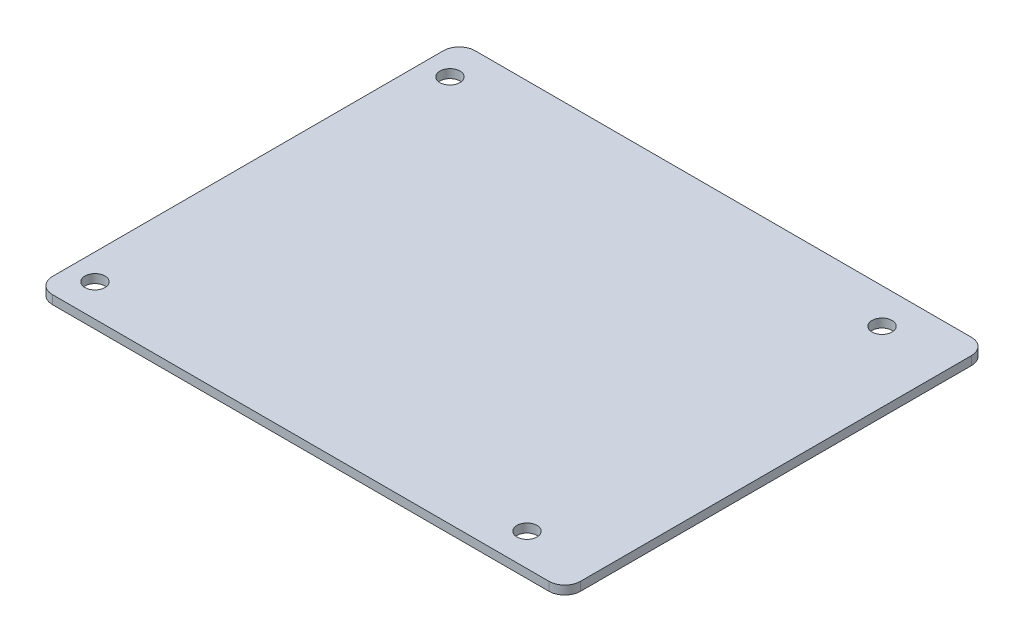
ISO-10303-21;
HEADER;
FILE_DESCRIPTION(('STEP AP214'),'2;1');
FILE_NAME('part.step','',(''),(''),'','','');
FILE_SCHEMA(('AUTOMOTIVE_DESIGN { 1 0 10303 214 1 1 1 1 }'));
ENDSEC;
DATA;
#1=APPLICATION_CONTEXT('core data for automotive mechanical design processes');
#2=APPLICATION_PROTOCOL_DEFINITION('international standard','automotive_design',2000,#1);
#3=PRODUCT_CONTEXT('',#1,'mechanical');
#4=PRODUCT('Part','Part','',(#3));
#5=PRODUCT_RELATED_PRODUCT_CATEGORY('part','',(#4));
#6=PRODUCT_DEFINITION_FORMATION('','',#4);
#7=PRODUCT_DEFINITION_CONTEXT('part definition',#1,'design');
#8=PRODUCT_DEFINITION('design','',#6,#7);
#9=PRODUCT_DEFINITION_SHAPE('','',#8);
#10=(LENGTH_UNIT() NAMED_UNIT(*) SI_UNIT(.MILLI.,.METRE.));
#11=(NAMED_UNIT(*) PLANE_ANGLE_UNIT() SI_UNIT($,.RADIAN.));
#12=(NAMED_UNIT(*) SI_UNIT($,.STERADIAN.) SOLID_ANGLE_UNIT());
#13=UNCERTAINTY_MEASURE_WITH_UNIT(LENGTH_MEASURE(1.E-05),#10,'distance_accuracy_value','');
#14=(GEOMETRIC_REPRESENTATION_CONTEXT(3) GLOBAL_UNCERTAINTY_ASSIGNED_CONTEXT((#13)) GLOBAL_UNIT_ASSIGNED_CONTEXT((#10,
#11,#12)) REPRESENTATION_CONTEXT('',''));
#15=CARTESIAN_POINT('',(0.,0.,0.));
#16=DIRECTION('',(0.,0.,1.));
#17=DIRECTION('',(1.,0.,0.));
#18=AXIS2_PLACEMENT_3D('',#15,#16,#17);
#19=CARTESIAN_POINT('',(-50.06,0.825,40.06));
#20=DIRECTION('',(1.,0.,0.));
#21=DIRECTION('',(0.,0.,-1.));
#22=AXIS2_PLACEMENT_3D('',#19,#20,#21);
#23=PLANE('',#22);
#24=DIRECTION('',(0.,0.,1.));
#25=VECTOR('',#24,1.);
#26=CARTESIAN_POINT('',(-50.06,0.825,40.06));
#27=LINE('',#26,#25);
#28=CARTESIAN_POINT('',(-50.06,0.825,-37.06));
#29=VERTEX_POINT('',#28);
#30=CARTESIAN_POINT('',(-50.06,0.825,37.06));
#31=VERTEX_POINT('',#30);
#32=EDGE_CURVE('E132',#29,#31,#27,.T.);
#33=ORIENTED_EDGE('',*,*,#32,.F.);
#34=DIRECTION('',(0.,-1.,0.));
#35=VECTOR('',#34,1.);
#36=CARTESIAN_POINT('',(-50.06,0.825,-37.06));
#37=LINE('',#36,#35);
#38=CARTESIAN_POINT('',(-50.06,-0.825,-37.06));
#39=VERTEX_POINT('',#38);
#40=EDGE_CURVE('E116',#29,#39,#37,.T.);
#41=ORIENTED_EDGE('',*,*,#40,.T.);
#42=DIRECTION('',(0.,0.,1.));
#43=VECTOR('',#42,1.);
#44=CARTESIAN_POINT('',(-50.06,-0.825,40.06));
#45=LINE('',#44,#43);
#46=CARTESIAN_POINT('',(-50.06,-0.825,37.06));
#47=VERTEX_POINT('',#46);
#48=EDGE_CURVE('E129',#39,#47,#45,.T.);
#49=ORIENTED_EDGE('',*,*,#48,.T.);
#50=DIRECTION('',(0.,-1.,0.));
#51=VECTOR('',#50,1.);
#52=CARTESIAN_POINT('',(-50.06,0.825,37.06));
#53=LINE('',#52,#51);
#54=EDGE_CURVE('E135',#47,#31,#53,.F.);
#55=ORIENTED_EDGE('',*,*,#54,.T.);
#56=EDGE_LOOP('',(#33,#41,#49,#55));
#57=FACE_BOUND('',#56,.T.);
#58=ADVANCED_FACE('F45',(#57),#23,.F.);
#59=CARTESIAN_POINT('',(50.06,0.825,40.06));
#60=DIRECTION('',(0.,0.,-1.));
#61=DIRECTION('',(-1.,0.,0.));
#62=AXIS2_PLACEMENT_3D('',#59,#60,#61);
#63=PLANE('',#62);
#64=DIRECTION('',(1.,0.,0.));
#65=VECTOR('',#64,1.);
#66=CARTESIAN_POINT('',(50.06,-0.825,40.06));
#67=LINE('',#66,#65);
#68=CARTESIAN_POINT('',(-47.06,-0.825,40.06));
#69=VERTEX_POINT('',#68);
#70=CARTESIAN_POINT('',(47.06,-0.825,40.06));
#71=VERTEX_POINT('',#70);
#72=EDGE_CURVE('E140',#69,#71,#67,.T.);
#73=ORIENTED_EDGE('',*,*,#72,.T.);
#74=DIRECTION('',(0.,-1.,0.));
#75=VECTOR('',#74,1.);
#76=CARTESIAN_POINT('',(47.06,0.825,40.06));
#77=LINE('',#76,#75);
#78=CARTESIAN_POINT('',(47.06,0.825,40.06));
#79=VERTEX_POINT('',#78);
#80=EDGE_CURVE('E11',#71,#79,#77,.F.);
#81=ORIENTED_EDGE('',*,*,#80,.T.);
#82=DIRECTION('',(1.,0.,0.));
#83=VECTOR('',#82,1.);
#84=CARTESIAN_POINT('',(50.06,0.825,40.06));
#85=LINE('',#84,#83);
#86=CARTESIAN_POINT('',(-47.06,0.825,40.06));
#87=VERTEX_POINT('',#86);
#88=EDGE_CURVE('E197',#87,#79,#85,.T.);
#89=ORIENTED_EDGE('',*,*,#88,.F.);
#90=DIRECTION('',(0.,-1.,0.));
#91=VECTOR('',#90,1.);
#92=CARTESIAN_POINT('',(-47.06,0.825,40.06));
#93=LINE('',#92,#91);
#94=EDGE_CURVE('E54',#87,#69,#93,.T.);
#95=ORIENTED_EDGE('',*,*,#94,.T.);
#96=EDGE_LOOP('',(#73,#81,#89,#95));
#97=FACE_BOUND('',#96,.T.);
#98=ADVANCED_FACE('F195',(#97),#63,.F.);
#99=CARTESIAN_POINT('',(50.06,0.825,40.06));
#100=DIRECTION('',(-1.,0.,0.));
#101=DIRECTION('',(0.,0.,1.));
#102=AXIS2_PLACEMENT_3D('',#99,#100,#101);
#103=PLANE('',#102);
#104=DIRECTION('',(0.,0.,-1.));
#105=VECTOR('',#104,1.);
#106=CARTESIAN_POINT('',(50.06,-0.825,40.06));
#107=LINE('',#106,#105);
#108=CARTESIAN_POINT('',(50.06,-0.825,37.06));
#109=VERTEX_POINT('',#108);
#110=CARTESIAN_POINT('',(50.06,-0.825,-37.06));
#111=VERTEX_POINT('',#110);
#112=EDGE_CURVE('E146',#109,#111,#107,.T.);
#113=ORIENTED_EDGE('',*,*,#112,.T.);
#114=DIRECTION('',(0.,-1.,0.));
#115=VECTOR('',#114,1.);
#116=CARTESIAN_POINT('',(50.06,0.825,-37.06));
#117=LINE('',#116,#115);
#118=CARTESIAN_POINT('',(50.06,0.825,-37.06));
#119=VERTEX_POINT('',#118);
#120=EDGE_CURVE('E61',#111,#119,#117,.F.);
#121=ORIENTED_EDGE('',*,*,#120,.T.);
#122=DIRECTION('',(0.,0.,-1.));
#123=VECTOR('',#122,1.);
#124=CARTESIAN_POINT('',(50.06,0.825,40.06));
#125=LINE('',#124,#123);
#126=CARTESIAN_POINT('',(50.06,0.825,37.06));
#127=VERTEX_POINT('',#126);
#128=EDGE_CURVE('E205',#127,#119,#125,.T.);
#129=ORIENTED_EDGE('',*,*,#128,.F.);
#130=DIRECTION('',(0.,-1.,0.));
#131=VECTOR('',#130,1.);
#132=CARTESIAN_POINT('',(50.06,0.825,37.06));
#133=LINE('',#132,#131);
#134=EDGE_CURVE('E185',#127,#109,#133,.T.);
#135=ORIENTED_EDGE('',*,*,#134,.T.);
#136=EDGE_LOOP('',(#113,#121,#129,#135));
#137=FACE_BOUND('',#136,.T.);
#138=ADVANCED_FACE('F204',(#137),#103,.F.);
#139=CARTESIAN_POINT('',(50.06,0.825,-40.06));
#140=DIRECTION('',(0.,0.,1.));
#141=DIRECTION('',(1.,0.,0.));
#142=AXIS2_PLACEMENT_3D('',#139,#140,#141);
#143=PLANE('',#142);
#144=DIRECTION('',(-1.,0.,0.));
#145=VECTOR('',#144,1.);
#146=CARTESIAN_POINT('',(50.06,-0.825,-40.06));
#147=LINE('',#146,#145);
#148=CARTESIAN_POINT('',(47.06,-0.825,-40.06));
#149=VERTEX_POINT('',#148);
#150=CARTESIAN_POINT('',(-47.06,-0.825,-40.06));
#151=VERTEX_POINT('',#150);
#152=EDGE_CURVE('E157',#149,#151,#147,.T.);
#153=ORIENTED_EDGE('',*,*,#152,.T.);
#154=DIRECTION('',(0.,-1.,0.));
#155=VECTOR('',#154,1.);
#156=CARTESIAN_POINT('',(-47.06,0.825,-40.06));
#157=LINE('',#156,#155);
#158=CARTESIAN_POINT('',(-47.06,0.825,-40.06));
#159=VERTEX_POINT('',#158);
#160=EDGE_CURVE('E117',#151,#159,#157,.F.);
#161=ORIENTED_EDGE('',*,*,#160,.T.);
#162=DIRECTION('',(-1.,0.,0.));
#163=VECTOR('',#162,1.);
#164=CARTESIAN_POINT('',(50.06,0.825,-40.06));
#165=LINE('',#164,#163);
#166=CARTESIAN_POINT('',(47.06,0.825,-40.06));
#167=VERTEX_POINT('',#166);
#168=EDGE_CURVE('E152',#167,#159,#165,.T.);
#169=ORIENTED_EDGE('',*,*,#168,.F.);
#170=DIRECTION('',(0.,-1.,0.));
#171=VECTOR('',#170,1.);
#172=CARTESIAN_POINT('',(47.06,0.825,-40.06));
#173=LINE('',#172,#171);
#174=EDGE_CURVE('E123',#167,#149,#173,.T.);
#175=ORIENTED_EDGE('',*,*,#174,.T.);
#176=EDGE_LOOP('',(#153,#161,#169,#175));
#177=FACE_BOUND('',#176,.T.);
#178=ADVANCED_FACE('F294',(#177),#143,.F.);
#179=CARTESIAN_POINT('',(0.,0.825,0.));
#180=DIRECTION('',(0.,1.,0.));
#181=DIRECTION('',(0.,0.,1.));
#182=AXIS2_PLACEMENT_3D('',#179,#180,#181);
#183=PLANE('',#182);
#184=CARTESIAN_POINT('',(36.76,0.825,-33.3925));
#185=DIRECTION('',(0.,1.,0.));
#186=DIRECTION('',(0.,0.,1.));
#187=AXIS2_PLACEMENT_3D('',#184,#185,#186);
#188=CIRCLE('',#187,1.905);
#189=CARTESIAN_POINT('',(36.76,0.825,-31.4875));
#190=VERTEX_POINT('',#189);
#191=EDGE_CURVE('E219',#190,#190,#188,.T.);
#192=ORIENTED_EDGE('',*,*,#191,.F.);
#193=EDGE_LOOP('',(#192));
#194=FACE_BOUND('',#193,.T.);
#195=CARTESIAN_POINT('',(36.76,0.825,33.9175));
#196=DIRECTION('',(0.,1.,0.));
#197=DIRECTION('',(0.,0.,1.));
#198=AXIS2_PLACEMENT_3D('',#195,#196,#197);
#199=CIRCLE('',#198,1.905);
#200=CARTESIAN_POINT('',(36.76,0.825,35.8225));
#201=VERTEX_POINT('',#200);
#202=EDGE_CURVE('E228',#201,#201,#199,.T.);
#203=ORIENTED_EDGE('',*,*,#202,.F.);
#204=EDGE_LOOP('',(#203));
#205=FACE_BOUND('',#204,.T.);
#206=CARTESIAN_POINT('',(-45.155,0.825,33.9175));
#207=DIRECTION('',(0.,1.,0.));
#208=DIRECTION('',(0.,0.,1.));
#209=AXIS2_PLACEMENT_3D('',#206,#207,#208);
#210=CIRCLE('',#209,1.905);
#211=CARTESIAN_POINT('',(-45.155,0.825,35.8225));
#212=VERTEX_POINT('',#211);
#213=EDGE_CURVE('E218',#212,#212,#210,.T.);
#214=ORIENTED_EDGE('',*,*,#213,.F.);
#215=EDGE_LOOP('',(#214));
#216=FACE_BOUND('',#215,.T.);
#217=CARTESIAN_POINT('',(-45.155,0.825,-33.3925));
#218=DIRECTION('',(0.,1.,0.));
#219=DIRECTION('',(0.,0.,1.));
#220=AXIS2_PLACEMENT_3D('',#217,#218,#219);
#221=CIRCLE('',#220,1.905);
#222=CARTESIAN_POINT('',(-45.155,0.825,-31.4875));
#223=VERTEX_POINT('',#222);
#224=EDGE_CURVE('E149',#223,#223,#221,.T.);
#225=ORIENTED_EDGE('',*,*,#224,.F.);
#226=EDGE_LOOP('',(#225));
#227=FACE_BOUND('',#226,.T.);
#228=ORIENTED_EDGE('',*,*,#168,.T.);
#229=CARTESIAN_POINT('',(-47.06,0.825,-37.06));
#230=DIRECTION('',(0.,1.,0.));
#231=DIRECTION('',(0.,0.,1.));
#232=AXIS2_PLACEMENT_3D('',#229,#230,#231);
#233=CIRCLE('',#232,3.);
#234=EDGE_CURVE('E182',#159,#29,#233,.T.);
#235=ORIENTED_EDGE('',*,*,#234,.T.);
#236=ORIENTED_EDGE('',*,*,#32,.T.);
#237=CARTESIAN_POINT('',(-47.06,0.825,37.06));
#238=DIRECTION('',(0.,1.,0.));
#239=DIRECTION('',(0.,0.,1.));
#240=AXIS2_PLACEMENT_3D('',#237,#238,#239);
#241=CIRCLE('',#240,3.);
#242=EDGE_CURVE('E174',#31,#87,#241,.T.);
#243=ORIENTED_EDGE('',*,*,#242,.T.);
#244=ORIENTED_EDGE('',*,*,#88,.T.);
#245=CARTESIAN_POINT('',(47.06,0.825,37.06));
#246=DIRECTION('',(0.,1.,0.));
#247=DIRECTION('',(0.,0.,1.));
#248=AXIS2_PLACEMENT_3D('',#245,#246,#247);
#249=CIRCLE('',#248,3.);
#250=EDGE_CURVE('E68',#79,#127,#249,.T.);
#251=ORIENTED_EDGE('',*,*,#250,.T.);
#252=ORIENTED_EDGE('',*,*,#128,.T.);
#253=CARTESIAN_POINT('',(47.06,0.825,-37.06));
#254=DIRECTION('',(0.,1.,0.));
#255=DIRECTION('',(0.,0.,1.));
#256=AXIS2_PLACEMENT_3D('',#253,#254,#255);
#257=CIRCLE('',#256,3.);
#258=EDGE_CURVE('E179',#119,#167,#257,.T.);
#259=ORIENTED_EDGE('',*,*,#258,.T.);
#260=EDGE_LOOP('',(#228,#235,#236,#243,#244,#251,#252,#259));
#261=FACE_BOUND('',#260,.T.);
#262=ADVANCED_FACE('F247',(#194,#205,#216,#227,#261),#183,.T.);
#263=CARTESIAN_POINT('',(0.,-0.825,0.));
#264=DIRECTION('',(0.,1.,0.));
#265=DIRECTION('',(0.,0.,1.));
#266=AXIS2_PLACEMENT_3D('',#263,#264,#265);
#267=PLANE('',#266);
#268=CARTESIAN_POINT('',(36.76,-0.825,-33.3925));
#269=DIRECTION('',(0.,1.,0.));
#270=DIRECTION('',(0.,0.,1.));
#271=AXIS2_PLACEMENT_3D('',#268,#269,#270);
#272=CIRCLE('',#271,1.905);
#273=CARTESIAN_POINT('',(36.76,-0.825,-31.4875));
#274=VERTEX_POINT('',#273);
#275=EDGE_CURVE('E224',#274,#274,#272,.F.);
#276=ORIENTED_EDGE('',*,*,#275,.F.);
#277=EDGE_LOOP('',(#276));
#278=FACE_BOUND('',#277,.T.);
#279=CARTESIAN_POINT('',(36.76,-0.825,33.9175));
#280=DIRECTION('',(0.,1.,0.));
#281=DIRECTION('',(0.,0.,1.));
#282=AXIS2_PLACEMENT_3D('',#279,#280,#281);
#283=CIRCLE('',#282,1.905);
#284=CARTESIAN_POINT('',(36.76,-0.825,35.8225));
#285=VERTEX_POINT('',#284);
#286=EDGE_CURVE('E223',#285,#285,#283,.F.);
#287=ORIENTED_EDGE('',*,*,#286,.F.);
#288=EDGE_LOOP('',(#287));
#289=FACE_BOUND('',#288,.T.);
#290=CARTESIAN_POINT('',(-45.155,-0.825,33.9175));
#291=DIRECTION('',(0.,1.,0.));
#292=DIRECTION('',(0.,0.,1.));
#293=AXIS2_PLACEMENT_3D('',#290,#291,#292);
#294=CIRCLE('',#293,1.905);
#295=CARTESIAN_POINT('',(-45.155,-0.825,35.8225));
#296=VERTEX_POINT('',#295);
#297=EDGE_CURVE('E232',#296,#296,#294,.F.);
#298=ORIENTED_EDGE('',*,*,#297,.F.);
#299=EDGE_LOOP('',(#298));
#300=FACE_BOUND('',#299,.T.);
#301=CARTESIAN_POINT('',(-45.155,-0.825,-33.3925));
#302=DIRECTION('',(0.,1.,0.));
#303=DIRECTION('',(0.,0.,1.));
#304=AXIS2_PLACEMENT_3D('',#301,#302,#303);
#305=CIRCLE('',#304,1.905);
#306=CARTESIAN_POINT('',(-45.155,-0.825,-31.4875));
#307=VERTEX_POINT('',#306);
#308=EDGE_CURVE('E141',#307,#307,#305,.F.);
#309=ORIENTED_EDGE('',*,*,#308,.F.);
#310=EDGE_LOOP('',(#309));
#311=FACE_BOUND('',#310,.T.);
#312=ORIENTED_EDGE('',*,*,#48,.F.);
#313=CARTESIAN_POINT('',(-47.06,-0.825,-37.06));
#314=DIRECTION('',(0.,1.,0.));
#315=DIRECTION('',(0.,0.,1.));
#316=AXIS2_PLACEMENT_3D('',#313,#314,#315);
#317=CIRCLE('',#316,3.);
#318=EDGE_CURVE('E112',#39,#151,#317,.F.);
#319=ORIENTED_EDGE('',*,*,#318,.T.);
#320=ORIENTED_EDGE('',*,*,#152,.F.);
#321=CARTESIAN_POINT('',(47.06,-0.825,-37.06));
#322=DIRECTION('',(0.,1.,0.));
#323=DIRECTION('',(0.,0.,1.));
#324=AXIS2_PLACEMENT_3D('',#321,#322,#323);
#325=CIRCLE('',#324,3.);
#326=EDGE_CURVE('E124',#149,#111,#325,.F.);
#327=ORIENTED_EDGE('',*,*,#326,.T.);
#328=ORIENTED_EDGE('',*,*,#112,.F.);
#329=CARTESIAN_POINT('',(47.06,-0.825,37.06));
#330=DIRECTION('',(0.,1.,0.));
#331=DIRECTION('',(0.,0.,1.));
#332=AXIS2_PLACEMENT_3D('',#329,#330,#331);
#333=CIRCLE('',#332,3.);
#334=EDGE_CURVE('E164',#109,#71,#333,.F.);
#335=ORIENTED_EDGE('',*,*,#334,.T.);
#336=ORIENTED_EDGE('',*,*,#72,.F.);
#337=CARTESIAN_POINT('',(-47.06,-0.825,37.06));
#338=DIRECTION('',(0.,1.,0.));
#339=DIRECTION('',(0.,0.,1.));
#340=AXIS2_PLACEMENT_3D('',#337,#338,#339);
#341=CIRCLE('',#340,3.);
#342=EDGE_CURVE('E134',#69,#47,#341,.F.);
#343=ORIENTED_EDGE('',*,*,#342,.T.);
#344=EDGE_LOOP('',(#312,#319,#320,#327,#328,#335,#336,#343));
#345=FACE_BOUND('',#344,.T.);
#346=ADVANCED_FACE('F137',(#278,#289,#300,#311,#345),#267,.F.);
#347=CARTESIAN_POINT('',(-47.06,0.825,-37.06));
#348=DIRECTION('',(0.,-1.,0.));
#349=DIRECTION('',(0.,0.,-1.));
#350=AXIS2_PLACEMENT_3D('',#347,#348,#349);
#351=CYLINDRICAL_SURFACE('',#350,3.);
#352=ORIENTED_EDGE('',*,*,#234,.F.);
#353=ORIENTED_EDGE('',*,*,#160,.F.);
#354=ORIENTED_EDGE('',*,*,#318,.F.);
#355=ORIENTED_EDGE('',*,*,#40,.F.);
#356=EDGE_LOOP('',(#352,#353,#354,#355));
#357=FACE_BOUND('',#356,.T.);
#358=ADVANCED_FACE('F115',(#357),#351,.T.);
#359=CARTESIAN_POINT('',(47.06,0.825,-37.06));
#360=DIRECTION('',(0.,-1.,0.));
#361=DIRECTION('',(0.,0.,-1.));
#362=AXIS2_PLACEMENT_3D('',#359,#360,#361);
#363=CYLINDRICAL_SURFACE('',#362,3.);
#364=ORIENTED_EDGE('',*,*,#258,.F.);
#365=ORIENTED_EDGE('',*,*,#120,.F.);
#366=ORIENTED_EDGE('',*,*,#326,.F.);
#367=ORIENTED_EDGE('',*,*,#174,.F.);
#368=EDGE_LOOP('',(#364,#365,#366,#367));
#369=FACE_BOUND('',#368,.T.);
#370=ADVANCED_FACE('F275',(#369),#363,.T.);
#371=CARTESIAN_POINT('',(47.06,0.825,37.06));
#372=DIRECTION('',(0.,-1.,0.));
#373=DIRECTION('',(0.,0.,-1.));
#374=AXIS2_PLACEMENT_3D('',#371,#372,#373);
#375=CYLINDRICAL_SURFACE('',#374,3.);
#376=ORIENTED_EDGE('',*,*,#250,.F.);
#377=ORIENTED_EDGE('',*,*,#80,.F.);
#378=ORIENTED_EDGE('',*,*,#334,.F.);
#379=ORIENTED_EDGE('',*,*,#134,.F.);
#380=EDGE_LOOP('',(#376,#377,#378,#379));
#381=FACE_BOUND('',#380,.T.);
#382=ADVANCED_FACE('F203',(#381),#375,.T.);
#383=CARTESIAN_POINT('',(-47.06,0.825,37.06));
#384=DIRECTION('',(0.,-1.,0.));
#385=DIRECTION('',(0.,0.,-1.));
#386=AXIS2_PLACEMENT_3D('',#383,#384,#385);
#387=CYLINDRICAL_SURFACE('',#386,3.);
#388=ORIENTED_EDGE('',*,*,#242,.F.);
#389=ORIENTED_EDGE('',*,*,#54,.F.);
#390=ORIENTED_EDGE('',*,*,#342,.F.);
#391=ORIENTED_EDGE('',*,*,#94,.F.);
#392=EDGE_LOOP('',(#388,#389,#390,#391));
#393=FACE_BOUND('',#392,.T.);
#394=ADVANCED_FACE('F47',(#393),#387,.T.);
#395=CARTESIAN_POINT('',(-45.155,-0.826,-33.3925));
#396=DIRECTION('',(0.,1.,0.));
#397=DIRECTION('',(0.,0.,1.));
#398=AXIS2_PLACEMENT_3D('',#395,#396,#397);
#399=CYLINDRICAL_SURFACE('',#398,1.905);
#400=ORIENTED_EDGE('',*,*,#224,.T.);
#401=EDGE_LOOP('',(#400));
#402=FACE_BOUND('',#401,.T.);
#403=ORIENTED_EDGE('',*,*,#308,.T.);
#404=EDGE_LOOP('',(#403));
#405=FACE_BOUND('',#404,.T.);
#406=ADVANCED_FACE('F252',(#402,#405),#399,.F.);
#407=CARTESIAN_POINT('',(-45.155,-0.826,33.9175));
#408=DIRECTION('',(0.,1.,0.));
#409=DIRECTION('',(0.,0.,1.));
#410=AXIS2_PLACEMENT_3D('',#407,#408,#409);
#411=CYLINDRICAL_SURFACE('',#410,1.905);
#412=ORIENTED_EDGE('',*,*,#213,.T.);
#413=EDGE_LOOP('',(#412));
#414=FACE_BOUND('',#413,.T.);
#415=ORIENTED_EDGE('',*,*,#297,.T.);
#416=EDGE_LOOP('',(#415));
#417=FACE_BOUND('',#416,.T.);
#418=ADVANCED_FACE('F243',(#414,#417),#411,.F.);
#419=CARTESIAN_POINT('',(36.76,-0.826,33.9175));
#420=DIRECTION('',(0.,1.,0.));
#421=DIRECTION('',(0.,0.,1.));
#422=AXIS2_PLACEMENT_3D('',#419,#420,#421);
#423=CYLINDRICAL_SURFACE('',#422,1.905);
#424=ORIENTED_EDGE('',*,*,#202,.T.);
#425=EDGE_LOOP('',(#424));
#426=FACE_BOUND('',#425,.T.);
#427=ORIENTED_EDGE('',*,*,#286,.T.);
#428=EDGE_LOOP('',(#427));
#429=FACE_BOUND('',#428,.T.);
#430=ADVANCED_FACE('F259',(#426,#429),#423,.F.);
#431=CARTESIAN_POINT('',(36.76,-0.826,-33.3925));
#432=DIRECTION('',(0.,1.,0.));
#433=DIRECTION('',(0.,0.,1.));
#434=AXIS2_PLACEMENT_3D('',#431,#432,#433);
#435=CYLINDRICAL_SURFACE('',#434,1.905);
#436=ORIENTED_EDGE('',*,*,#191,.T.);
#437=EDGE_LOOP('',(#436));
#438=FACE_BOUND('',#437,.T.);
#439=ORIENTED_EDGE('',*,*,#275,.T.);
#440=EDGE_LOOP('',(#439));
#441=FACE_BOUND('',#440,.T.);
#442=ADVANCED_FACE('F333',(#438,#441),#435,.F.);
#443=CLOSED_SHELL('',(#58,#98,#138,#178,#262,#346,#358,#370,#382,#394,#406,#418,#430,#442));
#444=MANIFOLD_SOLID_BREP('B2',#443);
#445=ADVANCED_BREP_SHAPE_REPRESENTATION('',(#18,#444),#14);
#446=SHAPE_DEFINITION_REPRESENTATION(#9,#445);
ENDSEC;
END-ISO-10303-21;
